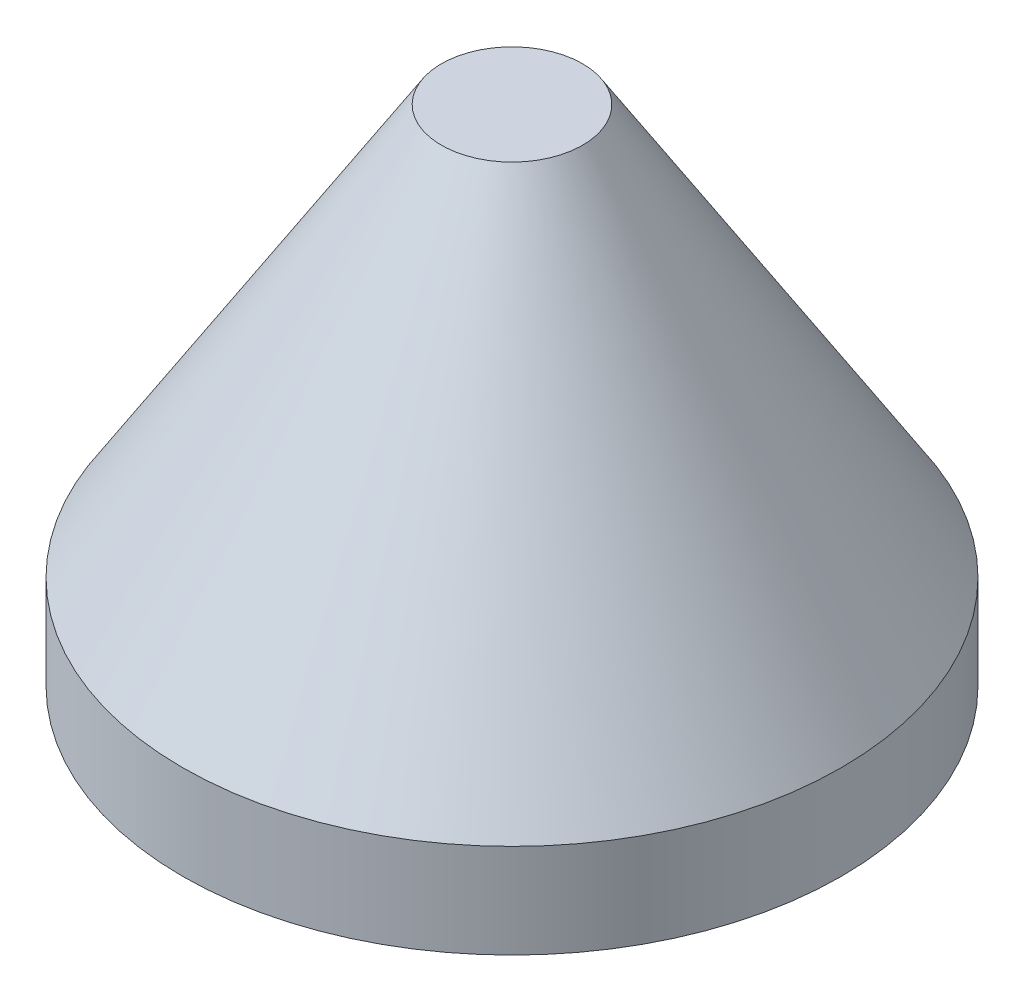
ISO-10303-21;
HEADER;
FILE_DESCRIPTION(('STEP AP214'),'2;1');
FILE_NAME('part.step','',(''),(''),'','','');
FILE_SCHEMA(('AUTOMOTIVE_DESIGN { 1 0 10303 214 1 1 1 1 }'));
ENDSEC;
DATA;
#1=APPLICATION_CONTEXT('core data for automotive mechanical design processes');
#2=APPLICATION_PROTOCOL_DEFINITION('international standard','automotive_design',2000,#1);
#3=PRODUCT_CONTEXT('',#1,'mechanical');
#4=PRODUCT('Part','Part','',(#3));
#5=PRODUCT_RELATED_PRODUCT_CATEGORY('part','',(#4));
#6=PRODUCT_DEFINITION_FORMATION('','',#4);
#7=PRODUCT_DEFINITION_CONTEXT('part definition',#1,'design');
#8=PRODUCT_DEFINITION('design','',#6,#7);
#9=PRODUCT_DEFINITION_SHAPE('','',#8);
#10=(LENGTH_UNIT() NAMED_UNIT(*) SI_UNIT(.MILLI.,.METRE.));
#11=(NAMED_UNIT(*) PLANE_ANGLE_UNIT() SI_UNIT($,.RADIAN.));
#12=(NAMED_UNIT(*) SI_UNIT($,.STERADIAN.) SOLID_ANGLE_UNIT());
#13=UNCERTAINTY_MEASURE_WITH_UNIT(LENGTH_MEASURE(1.E-05),#10,'distance_accuracy_value','');
#14=(GEOMETRIC_REPRESENTATION_CONTEXT(3) GLOBAL_UNCERTAINTY_ASSIGNED_CONTEXT((#13)) GLOBAL_UNIT_ASSIGNED_CONTEXT((#10,
#11,#12)) REPRESENTATION_CONTEXT('',''));
#15=CARTESIAN_POINT('',(0.,0.,0.));
#16=DIRECTION('',(0.,0.,1.));
#17=DIRECTION('',(1.,0.,0.));
#18=AXIS2_PLACEMENT_3D('',#15,#16,#17);
#19=CARTESIAN_POINT('',(0.,21.4,0.));
#20=DIRECTION('',(0.,-1.,0.));
#21=DIRECTION('',(0.,0.,-1.));
#22=AXIS2_PLACEMENT_3D('',#19,#20,#21);
#23=CYLINDRICAL_SURFACE('',#22,14.);
#24=CARTESIAN_POINT('',(0.,4.,0.));
#25=DIRECTION('',(0.,-1.,0.));
#26=DIRECTION('',(0.,0.,-1.));
#27=AXIS2_PLACEMENT_3D('',#24,#25,#26);
#28=CIRCLE('',#27,14.);
#29=CARTESIAN_POINT('',(0.,4.,-14.));
#30=VERTEX_POINT('',#29);
#31=EDGE_CURVE('E48',#30,#30,#28,.T.);
#32=ORIENTED_EDGE('',*,*,#31,.T.);
#33=EDGE_LOOP('',(#32));
#34=FACE_BOUND('',#33,.T.);
#35=CARTESIAN_POINT('',(0.,0.,0.));
#36=DIRECTION('',(0.,1.,0.));
#37=DIRECTION('',(0.,0.,1.));
#38=AXIS2_PLACEMENT_3D('',#35,#36,#37);
#39=CIRCLE('',#38,14.);
#40=CARTESIAN_POINT('',(0.,0.,14.));
#41=VERTEX_POINT('',#40);
#42=EDGE_CURVE('E10',#41,#41,#39,.T.);
#43=ORIENTED_EDGE('',*,*,#42,.T.);
#44=EDGE_LOOP('',(#43));
#45=FACE_BOUND('',#44,.T.);
#46=ADVANCED_FACE('F38',(#34,#45),#23,.T.);
#47=CARTESIAN_POINT('',(0.,0.,0.));
#48=DIRECTION('',(0.,1.,0.));
#49=DIRECTION('',(0.,0.,1.));
#50=AXIS2_PLACEMENT_3D('',#47,#48,#49);
#51=PLANE('',#50);
#52=ORIENTED_EDGE('',*,*,#42,.F.);
#53=EDGE_LOOP('',(#52));
#54=FACE_BOUND('',#53,.T.);
#55=ADVANCED_FACE('F59',(#54),#51,.F.);
#56=CARTESIAN_POINT('',(0.,21.4,0.));
#57=DIRECTION('',(0.,-1.,0.));
#58=DIRECTION('',(0.,0.,-1.));
#59=AXIS2_PLACEMENT_3D('',#56,#57,#58);
#60=CONICAL_SURFACE('',#59,3.,0.563748600418771);
#61=CARTESIAN_POINT('',(0.,21.4,0.));
#62=DIRECTION('',(0.,-1.,0.));
#63=DIRECTION('',(0.,0.,-1.));
#64=AXIS2_PLACEMENT_3D('',#61,#62,#63);
#65=CIRCLE('',#64,3.);
#66=CARTESIAN_POINT('',(0.,21.4,-3.));
#67=VERTEX_POINT('',#66);
#68=EDGE_CURVE('E44',#67,#67,#65,.T.);
#69=CARTESIAN_POINT('',(0.,4.,-14.));
#70=CARTESIAN_POINT('',(0.,4.18125,-13.8854166666667));
#71=CARTESIAN_POINT('',(0.,4.3625,-13.7708333333333));
#72=CARTESIAN_POINT('',(0.,4.725,-13.5416666666667));
#73=CARTESIAN_POINT('',(0.,4.90625,-13.4270833333333));
#74=CARTESIAN_POINT('',(0.,5.26875,-13.1979166666667));
#75=CARTESIAN_POINT('',(0.,5.45,-13.0833333333333));
#76=CARTESIAN_POINT('',(0.,5.8125,-12.8541666666667));
#77=CARTESIAN_POINT('',(0.,5.99375,-12.7395833333333));
#78=CARTESIAN_POINT('',(0.,6.35625,-12.5104166666667));
#79=CARTESIAN_POINT('',(0.,6.5375,-12.3958333333333));
#80=CARTESIAN_POINT('',(0.,6.9,-12.1666666666667));
#81=CARTESIAN_POINT('',(0.,7.08125,-12.0520833333333));
#82=CARTESIAN_POINT('',(0.,7.44375,-11.8229166666667));
#83=CARTESIAN_POINT('',(0.,7.625,-11.7083333333333));
#84=CARTESIAN_POINT('',(0.,7.9875,-11.4791666666667));
#85=CARTESIAN_POINT('',(0.,8.16875,-11.3645833333333));
#86=CARTESIAN_POINT('',(0.,8.53125,-11.1354166666667));
#87=CARTESIAN_POINT('',(0.,8.7125,-11.0208333333333));
#88=CARTESIAN_POINT('',(0.,9.075,-10.7916666666667));
#89=CARTESIAN_POINT('',(0.,9.25625,-10.6770833333333));
#90=CARTESIAN_POINT('',(0.,9.61875,-10.4479166666667));
#91=CARTESIAN_POINT('',(0.,9.8,-10.3333333333333));
#92=CARTESIAN_POINT('',(0.,10.1625,-10.1041666666667));
#93=CARTESIAN_POINT('',(0.,10.34375,-9.98958333333333));
#94=CARTESIAN_POINT('',(0.,10.70625,-9.76041666666667));
#95=CARTESIAN_POINT('',(0.,10.8875,-9.64583333333333));
#96=CARTESIAN_POINT('',(0.,11.25,-9.41666666666667));
#97=CARTESIAN_POINT('',(0.,11.43125,-9.30208333333333));
#98=CARTESIAN_POINT('',(0.,11.79375,-9.07291666666667));
#99=CARTESIAN_POINT('',(0.,11.975,-8.95833333333333));
#100=CARTESIAN_POINT('',(0.,12.3375,-8.72916666666667));
#101=CARTESIAN_POINT('',(0.,12.51875,-8.61458333333333));
#102=CARTESIAN_POINT('',(0.,12.88125,-8.38541666666667));
#103=CARTESIAN_POINT('',(0.,13.0625,-8.27083333333334));
#104=CARTESIAN_POINT('',(0.,13.425,-8.04166666666667));
#105=CARTESIAN_POINT('',(0.,13.60625,-7.92708333333333));
#106=CARTESIAN_POINT('',(0.,13.96875,-7.69791666666667));
#107=CARTESIAN_POINT('',(0.,14.15,-7.58333333333333));
#108=CARTESIAN_POINT('',(0.,14.5125,-7.35416666666667));
#109=CARTESIAN_POINT('',(0.,14.69375,-7.23958333333333));
#110=CARTESIAN_POINT('',(0.,15.05625,-7.01041666666667));
#111=CARTESIAN_POINT('',(0.,15.2375,-6.89583333333333));
#112=CARTESIAN_POINT('',(0.,15.6,-6.66666666666667));
#113=CARTESIAN_POINT('',(0.,15.78125,-6.55208333333333));
#114=CARTESIAN_POINT('',(0.,16.14375,-6.32291666666667));
#115=CARTESIAN_POINT('',(0.,16.325,-6.20833333333333));
#116=CARTESIAN_POINT('',(0.,16.6875,-5.97916666666666));
#117=CARTESIAN_POINT('',(0.,16.86875,-5.86458333333333));
#118=CARTESIAN_POINT('',(0.,17.23125,-5.63541666666666));
#119=CARTESIAN_POINT('',(0.,17.4125,-5.52083333333333));
#120=CARTESIAN_POINT('',(0.,17.775,-5.29166666666666));
#121=CARTESIAN_POINT('',(0.,17.95625,-5.17708333333333));
#122=CARTESIAN_POINT('',(0.,18.31875,-4.94791666666666));
#123=CARTESIAN_POINT('',(0.,18.5,-4.83333333333333));
#124=CARTESIAN_POINT('',(0.,18.8625,-4.60416666666666));
#125=CARTESIAN_POINT('',(0.,19.04375,-4.48958333333333));
#126=CARTESIAN_POINT('',(0.,19.40625,-4.26041666666666));
#127=CARTESIAN_POINT('',(0.,19.5875,-4.14583333333333));
#128=CARTESIAN_POINT('',(0.,19.95,-3.91666666666666));
#129=CARTESIAN_POINT('',(0.,20.13125,-3.80208333333333));
#130=CARTESIAN_POINT('',(0.,20.49375,-3.57291666666666));
#131=CARTESIAN_POINT('',(0.,20.675,-3.45833333333333));
#132=CARTESIAN_POINT('',(0.,21.0375,-3.22916666666666));
#133=CARTESIAN_POINT('',(0.,21.21875,-3.11458333333333));
#134=CARTESIAN_POINT('',(0.,21.4,-3.));
#135=B_SPLINE_CURVE_WITH_KNOTS('',3,(#69,#70,#71,#72,#73,#74,#75,#76,#77,#78,#79,#80,#81,#82,
#83,#84,#85,#86,#87,#88,#89,#90,#91,#92,#93,#94,#95,#96,#97,#98,#99,#100,#101,#102,#103,#104,
#105,#106,#107,#108,#109,#110,#111,#112,#113,#114,#115,#116,#117,#118,#119,#120,#121,#122,#123,
#124,#125,#126,#127,#128,#129,#130,#131,#132,#133,#134),.UNSPECIFIED.,.F.,.F.,(4,2,2,2,2,2,2,2,
2,2,2,2,2,2,2,2,2,2,2,2,2,2,2,2,2,2,2,2,2,2,2,2,4),(0.,0.643294741934052,1.28658948386811,
1.92988422580216,2.57317896773621,3.21647370967027,3.85976845160432,4.50306319353837,
5.14635793547242,5.78965267740648,6.43294741934053,7.07624216127459,7.71953690320864,
8.36283164514269,9.00612638707675,9.6494211290108,10.2927158709449,10.9360106128789,
11.579305354813,12.222600096747,12.8658948386811,13.5091895806151,14.1524843225492,
14.7957790644832,15.4390738064173,16.0823685483513,16.7256632902854,17.3689580322194,
18.0122527741535,18.6555475160875,19.2988422580216,19.9421369999557,20.5854317418897),.UNSPECIFIED.);
#136=EDGE_CURVE('BSEAM56',#30,#67,#135,.T.);
#137=ORIENTED_EDGE('',*,*,#31,.F.);
#138=ORIENTED_EDGE('',*,*,#68,.T.);
#139=ORIENTED_EDGE('',*,*,#136,.T.);
#140=ORIENTED_EDGE('',*,*,#136,.F.);
#141=EDGE_LOOP('',(#137,#139,#138,#140));
#142=FACE_BOUND('',#141,.T.);
#143=ADVANCED_FACE('F56',(#142),#60,.T.);
#144=CARTESIAN_POINT('',(0.,21.4,0.));
#145=DIRECTION('',(0.,1.,0.));
#146=DIRECTION('',(0.,0.,1.));
#147=AXIS2_PLACEMENT_3D('',#144,#145,#146);
#148=PLANE('',#147);
#149=ORIENTED_EDGE('',*,*,#68,.F.);
#150=EDGE_LOOP('',(#149));
#151=FACE_BOUND('',#150,.T.);
#152=ADVANCED_FACE('F58',(#151),#148,.T.);
#153=CLOSED_SHELL('',(#46,#55,#143,#152));
#154=MANIFOLD_SOLID_BREP('B2',#153);
#155=ADVANCED_BREP_SHAPE_REPRESENTATION('',(#18,#154),#14);
#156=SHAPE_DEFINITION_REPRESENTATION(#9,#155);
ENDSEC;
END-ISO-10303-21;
